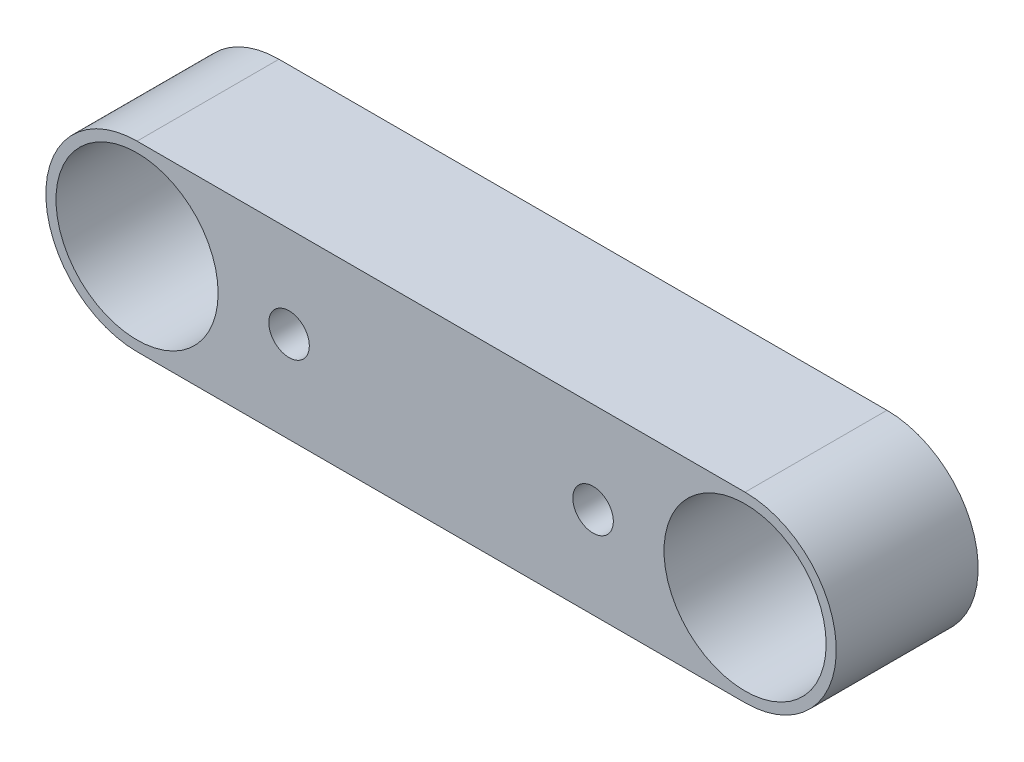
ISO-10303-21;
HEADER;
FILE_DESCRIPTION(('STEP AP214'),'2;1');
FILE_NAME('part.step','',(''),(''),'','','');
FILE_SCHEMA(('AUTOMOTIVE_DESIGN { 1 0 10303 214 1 1 1 1 }'));
ENDSEC;
DATA;
#1=APPLICATION_CONTEXT('core data for automotive mechanical design processes');
#2=APPLICATION_PROTOCOL_DEFINITION('international standard','automotive_design',2000,#1);
#3=PRODUCT_CONTEXT('',#1,'mechanical');
#4=PRODUCT('Part','Part','',(#3));
#5=PRODUCT_RELATED_PRODUCT_CATEGORY('part','',(#4));
#6=PRODUCT_DEFINITION_FORMATION('','',#4);
#7=PRODUCT_DEFINITION_CONTEXT('part definition',#1,'design');
#8=PRODUCT_DEFINITION('design','',#6,#7);
#9=PRODUCT_DEFINITION_SHAPE('','',#8);
#10=(LENGTH_UNIT() NAMED_UNIT(*) SI_UNIT(.MILLI.,.METRE.));
#11=(NAMED_UNIT(*) PLANE_ANGLE_UNIT() SI_UNIT($,.RADIAN.));
#12=(NAMED_UNIT(*) SI_UNIT($,.STERADIAN.) SOLID_ANGLE_UNIT());
#13=UNCERTAINTY_MEASURE_WITH_UNIT(LENGTH_MEASURE(1.E-05),#10,'distance_accuracy_value','');
#14=(GEOMETRIC_REPRESENTATION_CONTEXT(3) GLOBAL_UNCERTAINTY_ASSIGNED_CONTEXT((#13)) GLOBAL_UNIT_ASSIGNED_CONTEXT((#10,
#11,#12)) REPRESENTATION_CONTEXT('',''));
#15=CARTESIAN_POINT('',(0.,0.,0.));
#16=DIRECTION('',(0.,0.,1.));
#17=DIRECTION('',(1.,0.,0.));
#18=AXIS2_PLACEMENT_3D('',#15,#16,#17);
#19=CARTESIAN_POINT('',(-30.,0.,7.));
#20=DIRECTION('',(0.,0.,1.));
#21=DIRECTION('',(1.,0.,0.));
#22=AXIS2_PLACEMENT_3D('',#19,#20,#21);
#23=PLANE('',#22);
#24=CARTESIAN_POINT('',(-30.,0.,7.));
#25=DIRECTION('',(0.,0.,1.));
#26=DIRECTION('',(1.,0.,0.));
#27=AXIS2_PLACEMENT_3D('',#24,#25,#26);
#28=CIRCLE('',#27,8.);
#29=CARTESIAN_POINT('',(-22.,0.,7.));
#30=VERTEX_POINT('',#29);
#31=EDGE_CURVE('E129',#30,#30,#28,.T.);
#32=ORIENTED_EDGE('',*,*,#31,.F.);
#33=EDGE_LOOP('',(#32));
#34=FACE_BOUND('',#33,.T.);
#35=CARTESIAN_POINT('',(-15.,0.,7.));
#36=DIRECTION('',(0.,0.,1.));
#37=DIRECTION('',(1.,0.,0.));
#38=AXIS2_PLACEMENT_3D('',#35,#36,#37);
#39=CIRCLE('',#38,2.);
#40=CARTESIAN_POINT('',(-13.,0.,7.));
#41=VERTEX_POINT('',#40);
#42=EDGE_CURVE('E108',#41,#41,#39,.T.);
#43=ORIENTED_EDGE('',*,*,#42,.F.);
#44=EDGE_LOOP('',(#43));
#45=FACE_BOUND('',#44,.T.);
#46=CARTESIAN_POINT('',(-30.,0.,7.));
#47=DIRECTION('',(0.,0.,1.));
#48=DIRECTION('',(1.,0.,0.));
#49=AXIS2_PLACEMENT_3D('',#46,#47,#48);
#50=CIRCLE('',#49,8.99999999999999);
#51=CARTESIAN_POINT('',(-30.,8.99999999999999,7.));
#52=VERTEX_POINT('',#51);
#53=CARTESIAN_POINT('',(-30.,-9.,7.));
#54=VERTEX_POINT('',#53);
#55=EDGE_CURVE('E93',#52,#54,#50,.T.);
#56=ORIENTED_EDGE('',*,*,#55,.T.);
#57=DIRECTION('',(1.,0.,0.));
#58=VECTOR('',#57,1.);
#59=CARTESIAN_POINT('',(-30.,-9.,7.));
#60=LINE('',#59,#58);
#61=CARTESIAN_POINT('',(30.,-9.,7.));
#62=VERTEX_POINT('',#61);
#63=EDGE_CURVE('E88',#54,#62,#60,.T.);
#64=ORIENTED_EDGE('',*,*,#63,.T.);
#65=CARTESIAN_POINT('',(30.,0.,7.));
#66=DIRECTION('',(0.,0.,1.));
#67=DIRECTION('',(1.,0.,0.));
#68=AXIS2_PLACEMENT_3D('',#65,#66,#67);
#69=CIRCLE('',#68,8.99999999999999);
#70=CARTESIAN_POINT('',(30.,8.99999999999999,7.));
#71=VERTEX_POINT('',#70);
#72=EDGE_CURVE('E91',#62,#71,#69,.T.);
#73=ORIENTED_EDGE('',*,*,#72,.T.);
#74=DIRECTION('',(-1.,0.,0.));
#75=VECTOR('',#74,1.);
#76=CARTESIAN_POINT('',(-30.,8.99999999999999,7.));
#77=LINE('',#76,#75);
#78=EDGE_CURVE('E58',#71,#52,#77,.T.);
#79=ORIENTED_EDGE('',*,*,#78,.T.);
#80=EDGE_LOOP('',(#56,#64,#73,#79));
#81=FACE_BOUND('',#80,.T.);
#82=CARTESIAN_POINT('',(15.,0.,7.));
#83=DIRECTION('',(0.,0.,1.));
#84=DIRECTION('',(1.,0.,0.));
#85=AXIS2_PLACEMENT_3D('',#82,#83,#84);
#86=CIRCLE('',#85,2.00000000000001);
#87=CARTESIAN_POINT('',(17.,0.,7.));
#88=VERTEX_POINT('',#87);
#89=EDGE_CURVE('E123',#88,#88,#86,.T.);
#90=ORIENTED_EDGE('',*,*,#89,.F.);
#91=EDGE_LOOP('',(#90));
#92=FACE_BOUND('',#91,.T.);
#93=CARTESIAN_POINT('',(30.,0.,7.));
#94=DIRECTION('',(0.,0.,1.));
#95=DIRECTION('',(1.,0.,0.));
#96=AXIS2_PLACEMENT_3D('',#93,#94,#95);
#97=CIRCLE('',#96,8.);
#98=CARTESIAN_POINT('',(38.,0.,7.));
#99=VERTEX_POINT('',#98);
#100=EDGE_CURVE('E135',#99,#99,#97,.T.);
#101=ORIENTED_EDGE('',*,*,#100,.F.);
#102=EDGE_LOOP('',(#101));
#103=FACE_BOUND('',#102,.T.);
#104=ADVANCED_FACE('F41',(#34,#45,#81,#92,#103),#23,.T.);
#105=CARTESIAN_POINT('',(-30.,0.,-7.));
#106=DIRECTION('',(0.,0.,1.));
#107=DIRECTION('',(1.,0.,0.));
#108=AXIS2_PLACEMENT_3D('',#105,#106,#107);
#109=PLANE('',#108);
#110=CARTESIAN_POINT('',(-30.,0.,-7.));
#111=DIRECTION('',(0.,0.,1.));
#112=DIRECTION('',(1.,0.,0.));
#113=AXIS2_PLACEMENT_3D('',#110,#111,#112);
#114=CIRCLE('',#113,8.99999999999999);
#115=CARTESIAN_POINT('',(-30.,8.99999999999999,-7.));
#116=VERTEX_POINT('',#115);
#117=CARTESIAN_POINT('',(-30.,-9.,-7.));
#118=VERTEX_POINT('',#117);
#119=EDGE_CURVE('E105',#116,#118,#114,.T.);
#120=ORIENTED_EDGE('',*,*,#119,.F.);
#121=DIRECTION('',(-1.,0.,0.));
#122=VECTOR('',#121,1.);
#123=CARTESIAN_POINT('',(-30.,8.99999999999999,-7.));
#124=LINE('',#123,#122);
#125=CARTESIAN_POINT('',(30.,8.99999999999999,-7.));
#126=VERTEX_POINT('',#125);
#127=EDGE_CURVE('E81',#126,#116,#124,.T.);
#128=ORIENTED_EDGE('',*,*,#127,.F.);
#129=CARTESIAN_POINT('',(30.,0.,-7.));
#130=DIRECTION('',(0.,0.,1.));
#131=DIRECTION('',(1.,0.,0.));
#132=AXIS2_PLACEMENT_3D('',#129,#130,#131);
#133=CIRCLE('',#132,8.99999999999999);
#134=CARTESIAN_POINT('',(30.,-9.,-7.));
#135=VERTEX_POINT('',#134);
#136=EDGE_CURVE('E75',#135,#126,#133,.T.);
#137=ORIENTED_EDGE('',*,*,#136,.F.);
#138=DIRECTION('',(1.,0.,0.));
#139=VECTOR('',#138,1.);
#140=CARTESIAN_POINT('',(-30.,-9.,-7.));
#141=LINE('',#140,#139);
#142=EDGE_CURVE('E97',#118,#135,#141,.T.);
#143=ORIENTED_EDGE('',*,*,#142,.F.);
#144=EDGE_LOOP('',(#120,#128,#137,#143));
#145=FACE_BOUND('',#144,.T.);
#146=CARTESIAN_POINT('',(-15.,0.,-7.));
#147=DIRECTION('',(0.,0.,1.));
#148=DIRECTION('',(1.,0.,0.));
#149=AXIS2_PLACEMENT_3D('',#146,#147,#148);
#150=CIRCLE('',#149,2.);
#151=CARTESIAN_POINT('',(-13.,0.,-7.));
#152=VERTEX_POINT('',#151);
#153=EDGE_CURVE('E120',#152,#152,#150,.T.);
#154=ORIENTED_EDGE('',*,*,#153,.T.);
#155=EDGE_LOOP('',(#154));
#156=FACE_BOUND('',#155,.T.);
#157=CARTESIAN_POINT('',(15.,0.,-7.));
#158=DIRECTION('',(0.,0.,1.));
#159=DIRECTION('',(1.,0.,0.));
#160=AXIS2_PLACEMENT_3D('',#157,#158,#159);
#161=CIRCLE('',#160,2.00000000000001);
#162=CARTESIAN_POINT('',(17.,0.,-7.));
#163=VERTEX_POINT('',#162);
#164=EDGE_CURVE('E126',#163,#163,#161,.T.);
#165=ORIENTED_EDGE('',*,*,#164,.T.);
#166=EDGE_LOOP('',(#165));
#167=FACE_BOUND('',#166,.T.);
#168=CARTESIAN_POINT('',(-30.,0.,-7.));
#169=DIRECTION('',(0.,0.,1.));
#170=DIRECTION('',(1.,0.,0.));
#171=AXIS2_PLACEMENT_3D('',#168,#169,#170);
#172=CIRCLE('',#171,8.);
#173=CARTESIAN_POINT('',(-22.,0.,-7.));
#174=VERTEX_POINT('',#173);
#175=EDGE_CURVE('E132',#174,#174,#172,.T.);
#176=ORIENTED_EDGE('',*,*,#175,.T.);
#177=EDGE_LOOP('',(#176));
#178=FACE_BOUND('',#177,.T.);
#179=CARTESIAN_POINT('',(30.,0.,-7.));
#180=DIRECTION('',(0.,0.,1.));
#181=DIRECTION('',(1.,0.,0.));
#182=AXIS2_PLACEMENT_3D('',#179,#180,#181);
#183=CIRCLE('',#182,8.);
#184=CARTESIAN_POINT('',(38.,0.,-7.));
#185=VERTEX_POINT('',#184);
#186=EDGE_CURVE('E138',#185,#185,#183,.T.);
#187=ORIENTED_EDGE('',*,*,#186,.T.);
#188=EDGE_LOOP('',(#187));
#189=FACE_BOUND('',#188,.T.);
#190=ADVANCED_FACE('F116',(#145,#156,#167,#178,#189),#109,.F.);
#191=CARTESIAN_POINT('',(-30.,0.,7.));
#192=DIRECTION('',(0.,0.,-1.));
#193=DIRECTION('',(-1.,0.,0.));
#194=AXIS2_PLACEMENT_3D('',#191,#192,#193);
#195=CYLINDRICAL_SURFACE('',#194,8.99999999999999);
#196=ORIENTED_EDGE('',*,*,#119,.T.);
#197=DIRECTION('',(0.,0.,-1.));
#198=VECTOR('',#197,1.);
#199=CARTESIAN_POINT('',(-30.,-9.,7.));
#200=LINE('',#199,#198);
#201=EDGE_CURVE('E11',#54,#118,#200,.T.);
#202=ORIENTED_EDGE('',*,*,#201,.F.);
#203=ORIENTED_EDGE('',*,*,#55,.F.);
#204=DIRECTION('',(0.,0.,-1.));
#205=VECTOR('',#204,1.);
#206=CARTESIAN_POINT('',(-30.,8.99999999999999,7.));
#207=LINE('',#206,#205);
#208=EDGE_CURVE('E101',#52,#116,#207,.T.);
#209=ORIENTED_EDGE('',*,*,#208,.T.);
#210=EDGE_LOOP('',(#196,#202,#203,#209));
#211=FACE_BOUND('',#210,.T.);
#212=ADVANCED_FACE('F43',(#211),#195,.T.);
#213=CARTESIAN_POINT('',(-30.,-9.,7.));
#214=DIRECTION('',(0.,1.,0.));
#215=DIRECTION('',(0.,0.,1.));
#216=AXIS2_PLACEMENT_3D('',#213,#214,#215);
#217=PLANE('',#216);
#218=ORIENTED_EDGE('',*,*,#142,.T.);
#219=DIRECTION('',(0.,0.,-1.));
#220=VECTOR('',#219,1.);
#221=CARTESIAN_POINT('',(30.,-9.,7.));
#222=LINE('',#221,#220);
#223=EDGE_CURVE('E50',#62,#135,#222,.T.);
#224=ORIENTED_EDGE('',*,*,#223,.F.);
#225=ORIENTED_EDGE('',*,*,#63,.F.);
#226=ORIENTED_EDGE('',*,*,#201,.T.);
#227=EDGE_LOOP('',(#218,#224,#225,#226));
#228=FACE_BOUND('',#227,.T.);
#229=ADVANCED_FACE('F96',(#228),#217,.F.);
#230=CARTESIAN_POINT('',(30.,0.,7.));
#231=DIRECTION('',(0.,0.,-1.));
#232=DIRECTION('',(-1.,0.,0.));
#233=AXIS2_PLACEMENT_3D('',#230,#231,#232);
#234=CYLINDRICAL_SURFACE('',#233,8.99999999999999);
#235=ORIENTED_EDGE('',*,*,#136,.T.);
#236=DIRECTION('',(0.,0.,-1.));
#237=VECTOR('',#236,1.);
#238=CARTESIAN_POINT('',(30.,8.99999999999999,7.));
#239=LINE('',#238,#237);
#240=EDGE_CURVE('E98',#71,#126,#239,.T.);
#241=ORIENTED_EDGE('',*,*,#240,.F.);
#242=ORIENTED_EDGE('',*,*,#72,.F.);
#243=ORIENTED_EDGE('',*,*,#223,.T.);
#244=EDGE_LOOP('',(#235,#241,#242,#243));
#245=FACE_BOUND('',#244,.T.);
#246=ADVANCED_FACE('F99',(#245),#234,.T.);
#247=CARTESIAN_POINT('',(-30.,8.99999999999999,7.));
#248=DIRECTION('',(0.,-1.,0.));
#249=DIRECTION('',(0.,0.,-1.));
#250=AXIS2_PLACEMENT_3D('',#247,#248,#249);
#251=PLANE('',#250);
#252=ORIENTED_EDGE('',*,*,#127,.T.);
#253=ORIENTED_EDGE('',*,*,#208,.F.);
#254=ORIENTED_EDGE('',*,*,#78,.F.);
#255=ORIENTED_EDGE('',*,*,#240,.T.);
#256=EDGE_LOOP('',(#252,#253,#254,#255));
#257=FACE_BOUND('',#256,.T.);
#258=ADVANCED_FACE('F113',(#257),#251,.F.);
#259=CARTESIAN_POINT('',(-15.,0.,7.));
#260=DIRECTION('',(0.,0.,-1.));
#261=DIRECTION('',(-1.,0.,0.));
#262=AXIS2_PLACEMENT_3D('',#259,#260,#261);
#263=CYLINDRICAL_SURFACE('',#262,2.);
#264=ORIENTED_EDGE('',*,*,#42,.T.);
#265=EDGE_LOOP('',(#264));
#266=FACE_BOUND('',#265,.T.);
#267=ORIENTED_EDGE('',*,*,#153,.F.);
#268=EDGE_LOOP('',(#267));
#269=FACE_BOUND('',#268,.T.);
#270=ADVANCED_FACE('F157',(#266,#269),#263,.F.);
#271=CARTESIAN_POINT('',(15.,0.,7.));
#272=DIRECTION('',(0.,0.,-1.));
#273=DIRECTION('',(-1.,0.,0.));
#274=AXIS2_PLACEMENT_3D('',#271,#272,#273);
#275=CYLINDRICAL_SURFACE('',#274,2.00000000000001);
#276=ORIENTED_EDGE('',*,*,#89,.T.);
#277=EDGE_LOOP('',(#276));
#278=FACE_BOUND('',#277,.T.);
#279=ORIENTED_EDGE('',*,*,#164,.F.);
#280=EDGE_LOOP('',(#279));
#281=FACE_BOUND('',#280,.T.);
#282=ADVANCED_FACE('F202',(#278,#281),#275,.F.);
#283=CARTESIAN_POINT('',(-30.,0.,7.));
#284=DIRECTION('',(0.,0.,-1.));
#285=DIRECTION('',(-1.,0.,0.));
#286=AXIS2_PLACEMENT_3D('',#283,#284,#285);
#287=CYLINDRICAL_SURFACE('',#286,8.);
#288=ORIENTED_EDGE('',*,*,#31,.T.);
#289=EDGE_LOOP('',(#288));
#290=FACE_BOUND('',#289,.T.);
#291=ORIENTED_EDGE('',*,*,#175,.F.);
#292=EDGE_LOOP('',(#291));
#293=FACE_BOUND('',#292,.T.);
#294=ADVANCED_FACE('F210',(#290,#293),#287,.F.);
#295=CARTESIAN_POINT('',(30.,0.,7.));
#296=DIRECTION('',(0.,0.,-1.));
#297=DIRECTION('',(-1.,0.,0.));
#298=AXIS2_PLACEMENT_3D('',#295,#296,#297);
#299=CYLINDRICAL_SURFACE('',#298,8.);
#300=ORIENTED_EDGE('',*,*,#100,.T.);
#301=EDGE_LOOP('',(#300));
#302=FACE_BOUND('',#301,.T.);
#303=ORIENTED_EDGE('',*,*,#186,.F.);
#304=EDGE_LOOP('',(#303));
#305=FACE_BOUND('',#304,.T.);
#306=ADVANCED_FACE('F144',(#302,#305),#299,.F.);
#307=CLOSED_SHELL('',(#104,#190,#212,#229,#246,#258,#270,#282,#294,#306));
#308=MANIFOLD_SOLID_BREP('B2',#307);
#309=ADVANCED_BREP_SHAPE_REPRESENTATION('',(#18,#308),#14);
#310=SHAPE_DEFINITION_REPRESENTATION(#9,#309);
ENDSEC;
END-ISO-10303-21;
